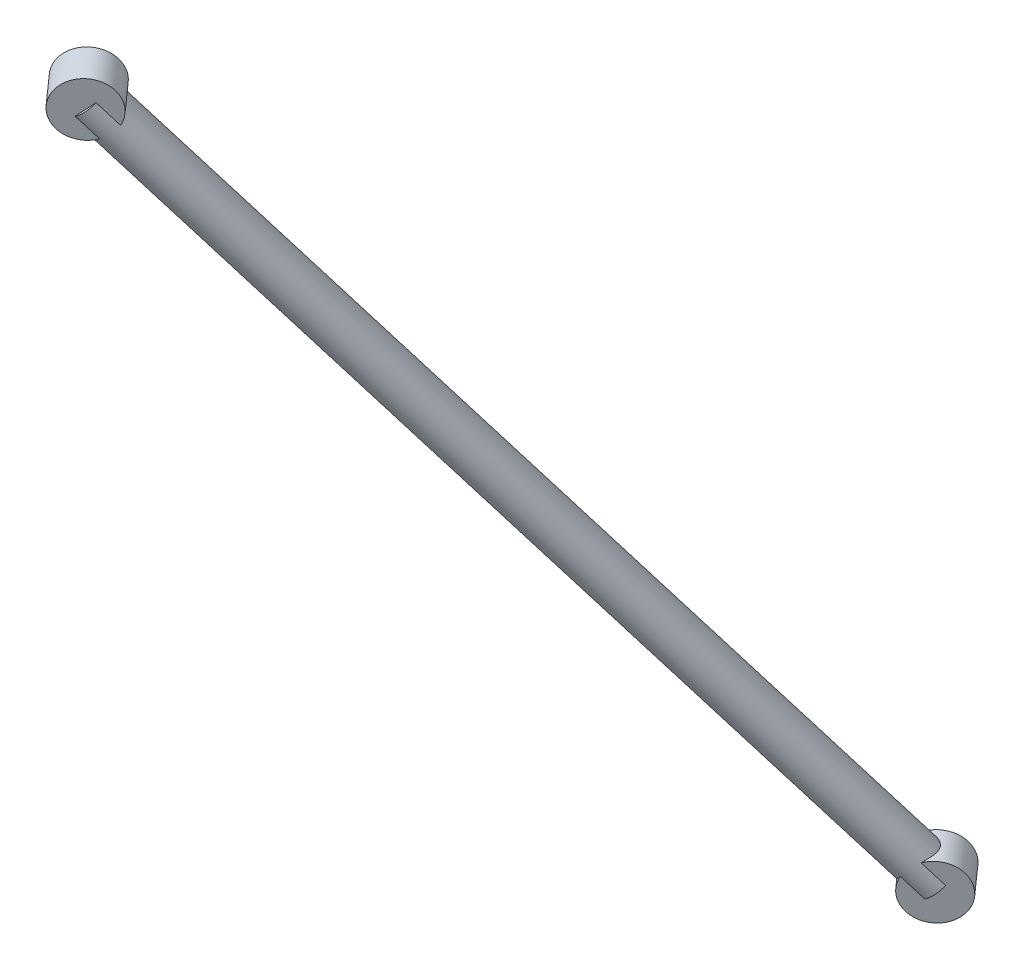
ISO-10303-21;
HEADER;
FILE_DESCRIPTION(('STEP AP214'),'2;1');
FILE_NAME('part.step','',(''),(''),'','','');
FILE_SCHEMA(('AUTOMOTIVE_DESIGN { 1 0 10303 214 1 1 1 1 }'));
ENDSEC;
DATA;
#1=APPLICATION_CONTEXT('core data for automotive mechanical design processes');
#2=APPLICATION_PROTOCOL_DEFINITION('international standard','automotive_design',2000,#1);
#3=PRODUCT_CONTEXT('',#1,'mechanical');
#4=PRODUCT('Part','Part','',(#3));
#5=PRODUCT_RELATED_PRODUCT_CATEGORY('part','',(#4));
#6=PRODUCT_DEFINITION_FORMATION('','',#4);
#7=PRODUCT_DEFINITION_CONTEXT('part definition',#1,'design');
#8=PRODUCT_DEFINITION('design','',#6,#7);
#9=PRODUCT_DEFINITION_SHAPE('','',#8);
#10=(LENGTH_UNIT() NAMED_UNIT(*) SI_UNIT(.MILLI.,.METRE.));
#11=(NAMED_UNIT(*) PLANE_ANGLE_UNIT() SI_UNIT($,.RADIAN.));
#12=(NAMED_UNIT(*) SI_UNIT($,.STERADIAN.) SOLID_ANGLE_UNIT());
#13=UNCERTAINTY_MEASURE_WITH_UNIT(LENGTH_MEASURE(1.E-05),#10,'distance_accuracy_value','');
#14=(GEOMETRIC_REPRESENTATION_CONTEXT(3) GLOBAL_UNCERTAINTY_ASSIGNED_CONTEXT((#13)) GLOBAL_UNIT_ASSIGNED_CONTEXT((#10,
#11,#12)) REPRESENTATION_CONTEXT('',''));
#15=CARTESIAN_POINT('',(0.,0.,0.));
#16=DIRECTION('',(0.,0.,1.));
#17=DIRECTION('',(1.,0.,0.));
#18=AXIS2_PLACEMENT_3D('',#15,#16,#17);
#19=CARTESIAN_POINT('',(-503.54,1408.46,-83.29));
#20=DIRECTION('',(0.463004376310124,-0.750306246149666,-0.47187655642813));
#21=DIRECTION('',(0.,0.532378141285444,-0.846506653654569));
#22=AXIS2_PLACEMENT_3D('',#19,#20,#21);
#23=CYLINDRICAL_SURFACE('',#22,8.);
#24=CARTESIAN_POINT('',(-491.863914324977,1402.83234435317,-84.7036876880866));
#25=CARTESIAN_POINT('',(-491.85256620821,1403.03874333603,-84.8521431734616));
#26=CARTESIAN_POINT('',(-491.853287924258,1403.24490120247,-85.0016301794647));
#27=CARTESIAN_POINT('',(-491.877322921821,1403.65437679307,-85.3023329251552));
#28=CARTESIAN_POINT('',(-491.900617023416,1403.85769677982,-85.4535470894709));
#29=CARTESIAN_POINT('',(-491.968344198661,1404.26014747147,-85.7581152110207));
#30=CARTESIAN_POINT('',(-492.012845517434,1404.45926246889,-85.9114745137641));
#31=CARTESIAN_POINT('',(-492.121533488613,1404.85059188627,-86.2200816451214));
#32=CARTESIAN_POINT('',(-492.18572451396,1405.04280476272,-86.3753298858918));
#33=CARTESIAN_POINT('',(-492.332203904931,1405.41761759253,-86.6877107418468));
#34=CARTESIAN_POINT('',(-492.414441410112,1405.60024280921,-86.8448369106474));
#35=CARTESIAN_POINT('',(-492.595857595428,1405.95412613622,-87.1621270032458));
#36=CARTESIAN_POINT('',(-492.695037630244,1406.12538333606,-87.3222911690431));
#37=CARTESIAN_POINT('',(-492.908994015216,1406.45354399163,-87.646353856462));
#38=CARTESIAN_POINT('',(-493.023746944959,1406.61046842087,-87.8102464684589));
#39=CARTESIAN_POINT('',(-493.267607604801,1406.90684345209,-88.1428657297398));
#40=CARTESIAN_POINT('',(-493.396708608668,1407.04630217714,-88.3115900866422));
#41=CARTESIAN_POINT('',(-493.7169283371,1407.35035002569,-88.716970107371));
#42=CARTESIAN_POINT('',(-493.913647892242,1407.50592670619,-88.9562246516567));
#43=CARTESIAN_POINT('',(-494.222550638404,1407.70069568203,-89.3232976855168));
#44=CARTESIAN_POINT('',(-494.327765298759,1407.75916612557,-89.446955818845));
#45=CARTESIAN_POINT('',(-494.541997226632,1407.86193790932,-89.6968007749519));
#46=CARTESIAN_POINT('',(-494.651012529246,1407.9062464541,-89.822986277152));
#47=CARTESIAN_POINT('',(-494.87281999964,1407.97984936826,-90.078420282753));
#48=CARTESIAN_POINT('',(-494.985636488568,1408.00901214188,-90.2076857495064));
#49=CARTESIAN_POINT('',(-495.213055890507,1408.05099235054,-90.4673048051152));
#50=CARTESIAN_POINT('',(-495.327658767294,1408.06381011658,-90.5976583718826));
#51=CARTESIAN_POINT('',(-495.557638236335,1408.07293859936,-90.8583315418811));
#52=CARTESIAN_POINT('',(-495.673015082423,1408.06924360672,-90.9886511177824));
#53=CARTESIAN_POINT('',(-495.903625617038,1408.04579310789,-91.2479445685601));
#54=CARTESIAN_POINT('',(-496.018859304315,1408.02603746241,-91.3769184317567));
#55=CARTESIAN_POINT('',(-496.237149823912,1407.97415441211,-91.6196025105796));
#56=CARTESIAN_POINT('',(-496.340279348235,1407.94345064141,-91.7335564588313));
#57=CARTESIAN_POINT('',(-496.545693496825,1407.87074669722,-91.9586126412972));
#58=CARTESIAN_POINT('',(-496.6479778034,1407.82874245899,-92.0697138336037));
#59=CARTESIAN_POINT('',(-496.953514905836,1407.68726425408,-92.3978087351166));
#60=CARTESIAN_POINT('',(-497.155409552831,1407.57233564368,-92.609546244689));
#61=CARTESIAN_POINT('',(-497.513337747955,1407.337530276,-92.9714818295932));
#62=CARTESIAN_POINT('',(-497.670019616982,1407.22386825422,-93.1252097360849));
#63=CARTESIAN_POINT('',(-497.982266716549,1406.9794767482,-93.4198936774244));
#64=CARTESIAN_POINT('',(-498.137831408804,1406.84873955176,-93.5608438920456));
#65=CARTESIAN_POINT('',(-498.448785468465,1406.57290408482,-93.8287850867103));
#66=CARTESIAN_POINT('',(-498.604174203398,1406.42778414654,-93.95575437776));
#67=CARTESIAN_POINT('',(-498.915282476585,1406.12574104747,-94.1942578580876));
#68=CARTESIAN_POINT('',(-499.071001982437,1405.96881899527,-94.3057934942779));
#69=CARTESIAN_POINT('',(-499.380411294963,1405.64826798491,-94.510192865804));
#70=CARTESIAN_POINT('',(-499.534083742902,1405.4848221541,-94.6033700159154));
#71=CARTESIAN_POINT('',(-499.842647911595,1405.15030656753,-94.7722912405186));
#72=CARTESIAN_POINT('',(-499.997539367585,1404.97923843161,-94.8480389981271));
#73=CARTESIAN_POINT('',(-500.308336606931,1404.63156012017,-94.9805240529461));
#74=CARTESIAN_POINT('',(-500.464238885673,1404.45496487152,-95.0373084104445));
#75=CARTESIAN_POINT('',(-500.777381224974,1404.09743062589,-95.1306475169436));
#76=CARTESIAN_POINT('',(-500.934622233853,1403.91648834934,-95.1671864578548));
#77=CARTESIAN_POINT('',(-501.092381544247,1403.73431411944,-95.1928170826297));
#78=B_SPLINE_CURVE_WITH_KNOTS('',3,(#24,#25,#26,#27,#28,#29,#30,#31,#32,#33,#34,#35,#36,#37,#38,
#39,#40,#41,#42,#43,#44,#45,#46,#47,#48,#49,#50,#51,#52,#53,#54,#55,#56,#57,#58,#59,#60,#61,#62,
#63,#64,#65,#66,#67,#68,#69,#70,#71,#72,#73,#74,#75,#76,#77),.UNSPECIFIED.,.F.,.F.,(4,2,2,2,2,2,
2,2,2,2,2,2,2,2,2,2,2,2,2,2,2,2,2,2,2,2,4),(0.,0.763011542653619,1.52537531682717,
2.29020912733124,3.05521292503443,3.81808778439847,4.58102366988254,5.34282461898683,
6.10426993796315,7.13968921486128,7.6568748493582,8.17379695619256,8.69513827194054,
9.21646903022712,9.73798005564118,10.2594956035652,10.7292144777066,11.1991025342618,
12.1390705688165,12.8797587803778,13.6207826970853,14.3629404532268,15.1050285845173,
15.8330728947378,16.560963215669,17.2870335154302,18.0136699515921),.UNSPECIFIED.);
#79=CARTESIAN_POINT('',(-491.863914324977,1402.83234435317,-84.7036876880866));
#80=VERTEX_POINT('',#79);
#81=CARTESIAN_POINT('',(-501.092381544247,1403.73431411944,-95.1928170826297));
#82=VERTEX_POINT('',#81);
#83=EDGE_CURVE('E235',#80,#82,#78,.T.);
#84=ORIENTED_EDGE('',*,*,#83,.F.);
#85=CARTESIAN_POINT('',(-491.248775776376,1401.83558166783,-85.330662047099));
#86=CARTESIAN_POINT('',(-492.474135273463,1403.82113862483,-84.0817255479092));
#87=CARTESIAN_POINT('',(-493.699494777207,1405.80669557443,-82.8327890434994));
#88=CARTESIAN_POINT('',(-496.15021379801,1409.77780945886,-80.3349160242396));
#89=CARTESIAN_POINT('',(-497.375573315069,1411.76336639368,-79.0859795093896));
#90=CARTESIAN_POINT('',(-498.600932838785,1413.74892332111,-77.8370429893195));
#91=B_SPLINE_CURVE_WITH_KNOTS('',3,(#85,#86,#87,#88,#89,#90),.UNSPECIFIED.,.F.,.F.,(4,2,4),(0.,
7.93939936961925,15.8787987392386),.UNSPECIFIED.);
#92=CARTESIAN_POINT('',(-496.63096819737,1410.55681775206,-79.8449114866413));
#93=VERTEX_POINT('',#92);
#94=EDGE_CURVE('E145',#80,#93,#91,.T.);
#95=ORIENTED_EDGE('',*,*,#94,.T.);
#96=CARTESIAN_POINT('',(-503.54,1408.46,-83.29));
#97=DIRECTION('',(0.463004376310124,-0.750306246149666,-0.471876556428131));
#98=DIRECTION('',(0.,0.532378141285444,-0.846506653654569));
#99=AXIS2_PLACEMENT_3D('',#96,#97,#98);
#100=CIRCLE('',#99,8.);
#101=CARTESIAN_POINT('',(-501.22125176223,1405.46044954045,-76.2454202644558));
#102=VERTEX_POINT('',#101);
#103=EDGE_CURVE('E133',#93,#102,#100,.T.);
#104=ORIENTED_EDGE('',*,*,#103,.T.);
#105=CARTESIAN_POINT('',(-501.230020040587,1405.47466099881,-76.2364829795065));
#106=CARTESIAN_POINT('',(-500.361767520144,1404.06741387008,-77.1214708719437));
#107=CARTESIAN_POINT('',(-499.493514996358,1402.66016674506,-78.0064587670026));
#108=CARTESIAN_POINT('',(-497.757009942099,1399.84567250244,-79.7764345623638));
#109=CARTESIAN_POINT('',(-496.888757411626,1398.43842538484,-80.6614224626661));
#110=CARTESIAN_POINT('',(-496.02050487781,1397.03117827095,-81.5464103655901));
#111=B_SPLINE_CURVE_WITH_KNOTS('',3,(#105,#106,#107,#108,#109,#110),.UNSPECIFIED.,.F.,.F.,(4,2,
4),(0.,5.6264282109585,11.2528564219171),.UNSPECIFIED.);
#112=CARTESIAN_POINT('',(-496.454885001526,1397.73521327492,-81.1036576642226));
#113=VERTEX_POINT('',#112);
#114=EDGE_CURVE('E241',#102,#113,#111,.T.);
#115=ORIENTED_EDGE('',*,*,#114,.T.);
#116=CARTESIAN_POINT('',(-505.681977863056,1398.63870892363,-91.5938647674842));
#117=CARTESIAN_POINT('',(-505.767014122679,1398.55166417616,-91.370366511703));
#118=CARTESIAN_POINT('',(-505.844538407707,1398.47224404748,-91.1411909301005));
#119=CARTESIAN_POINT('',(-505.983955243631,1398.32751807952,-90.6740168414139));
#120=CARTESIAN_POINT('',(-506.045861016426,1398.26220030866,-90.4360259940088));
#121=CARTESIAN_POINT('',(-506.153753193611,1398.14421019957,-89.9525865620582));
#122=CARTESIAN_POINT('',(-506.199687571368,1398.09157935648,-89.7071163860279));
#123=CARTESIAN_POINT('',(-506.274694789413,1397.99778939165,-89.2114098213395));
#124=CARTESIAN_POINT('',(-506.303763878213,1397.95663282327,-88.9611723850348));
#125=CARTESIAN_POINT('',(-506.344065487697,1397.88435035368,-88.4585486721727));
#126=CARTESIAN_POINT('',(-506.355347469127,1397.85319682997,-88.2061703233124));
#127=CARTESIAN_POINT('',(-506.359013735236,1397.79908002656,-87.700371526914));
#128=CARTESIAN_POINT('',(-506.351396511301,1397.77611740086,-87.4469509977969));
#129=CARTESIAN_POINT('',(-506.315654241644,1397.73657934558,-86.941381808078));
#130=CARTESIAN_POINT('',(-506.287559612271,1397.71999449846,-86.6892318189824));
#131=CARTESIAN_POINT('',(-506.208924569808,1397.69117874265,-86.1883455193517));
#132=CARTESIAN_POINT('',(-506.158394628203,1397.67894580755,-85.9396076719991));
#133=CARTESIAN_POINT('',(-506.009693451078,1397.65262687773,-85.3594795990231));
#134=CARTESIAN_POINT('',(-505.900918818933,1397.63945991859,-85.0305813243753));
#135=CARTESIAN_POINT('',(-505.699457879853,1397.6186588124,-84.5539732755285));
#136=CARTESIAN_POINT('',(-505.625968013687,1397.61155386684,-84.3979686741826));
#137=CARTESIAN_POINT('',(-505.465863279637,1397.59641235731,-84.0929265419795));
#138=CARTESIAN_POINT('',(-505.379255120524,1397.58837627002,-83.9438855006047));
#139=CARTESIAN_POINT('',(-505.192106116736,1397.57086902911,-83.6530827105097));
#140=CARTESIAN_POINT('',(-505.09145237154,1397.56138618196,-83.5113941797457));
#141=CARTESIAN_POINT('',(-504.877286800297,1397.54083267163,-83.2382072114555));
#142=CARTESIAN_POINT('',(-504.763775235656,1397.52976204073,-83.1067085668554));
#143=CARTESIAN_POINT('',(-504.524850196801,1397.5061029537,-82.855082361768));
#144=CARTESIAN_POINT('',(-504.399432640917,1397.49351397663,-82.7349587293134));
#145=CARTESIAN_POINT('',(-504.138102699315,1397.46716585418,-82.5068956554399));
#146=CARTESIAN_POINT('',(-504.002190223709,1397.45340669879,-82.3989563183969));
#147=CARTESIAN_POINT('',(-503.735410545092,1397.42667994505,-82.2056471585028));
#148=CARTESIAN_POINT('',(-503.605386107548,1397.41376973532,-82.1191003350518));
#149=CARTESIAN_POINT('',(-503.339215332545,1397.38795804921,-81.9559568406847));
#150=CARTESIAN_POINT('',(-503.203066807079,1397.37505657765,-81.8793637646591));
#151=CARTESIAN_POINT('',(-502.786900751246,1397.33717699197,-81.6640004818221));
#152=CARTESIAN_POINT('',(-502.499215260618,1397.31302931977,-81.5396834340206));
#153=CARTESIAN_POINT('',(-501.973499746772,1397.27582385085,-81.3487416460397));
#154=CARTESIAN_POINT('',(-501.737876471371,1397.26150024685,-81.2754731689921));
#155=CARTESIAN_POINT('',(-501.260987845144,1397.23896807349,-81.1485930169591));
#156=CARTESIAN_POINT('',(-501.019719985461,1397.23076227869,-81.0949902664389));
#157=CARTESIAN_POINT('',(-500.533403300467,1397.2223010552,-81.0057721834515));
#158=CARTESIAN_POINT('',(-500.288349250034,1397.22205782294,-80.9701845272163));
#159=CARTESIAN_POINT('',(-499.796593202122,1397.2312403937,-80.9157827080454));
#160=CARTESIAN_POINT('',(-499.549891361309,1397.24066529015,-80.8969669727524));
#161=CARTESIAN_POINT('',(-499.06111619334,1397.2704798162,-80.8753260456659));
#162=CARTESIAN_POINT('',(-498.819043126653,1397.2906597776,-80.8722066117474));
#163=CARTESIAN_POINT('',(-498.336517766788,1397.34324978083,-80.8805044253597));
#164=CARTESIAN_POINT('',(-498.096065141886,1397.37565723704,-80.8919186008418));
#165=CARTESIAN_POINT('',(-497.619034535195,1397.45393920454,-80.9287735635531));
#166=CARTESIAN_POINT('',(-497.382448354605,1397.49977976898,-80.9541791337005));
#167=CARTESIAN_POINT('',(-496.914329600986,1397.6061673227,-81.0187030094721));
#168=CARTESIAN_POINT('',(-496.68280110955,1397.66672574388,-81.0578319850869));
#169=CARTESIAN_POINT('',(-496.454885001525,1397.73521327492,-81.1036576642227));
#170=B_SPLINE_CURVE_WITH_KNOTS('',3,(#116,#117,#118,#119,#120,#121,#122,#123,#124,#125,#126,
#127,#128,#129,#130,#131,#132,#133,#134,#135,#136,#137,#138,#139,#140,#141,#142,#143,#144,#145,
#146,#147,#148,#149,#150,#151,#152,#153,#154,#155,#156,#157,#158,#159,#160,#161,#162,#163,#164,
#165,#166,#167,#168,#169),.UNSPECIFIED.,.F.,.F.,(4,2,2,2,2,2,2,2,2,2,2,2,2,2,2,2,2,2,2,2,2,2,2,
2,2,2,4),(0.,0.762958906264851,1.52526974359427,2.29004103323215,3.05498237225947,
3.81779285757181,4.58066423562403,5.34240477719363,6.10379015616976,7.13935621584745,
7.65661504598379,8.17361023455515,8.69503018868879,9.21643954399872,9.73802830137107,
10.2596215265592,10.7293351342425,11.1992179147803,12.1391755457856,12.879810570836,
13.6207812874993,14.3628869141437,15.1049229615158,15.8329956148144,16.5609143969497,
17.2870092879687,18.0136699761481),.UNSPECIFIED.);
#171=CARTESIAN_POINT('',(-505.681977863056,1398.63870892363,-91.5938647674842));
#172=VERTEX_POINT('',#171);
#173=EDGE_CURVE('E213',#172,#113,#170,.T.);
#174=ORIENTED_EDGE('',*,*,#173,.F.);
#175=CARTESIAN_POINT('',(-510.631047949373,1406.65811889125,-86.5495702153982));
#176=CARTESIAN_POINT('',(-509.733743856513,1405.20413877994,-87.4641392305622));
#177=CARTESIAN_POINT('',(-508.836439760081,1403.75015867259,-88.3787082485265));
#178=CARTESIAN_POINT('',(-507.041831560075,1400.84219846582,-90.2078462900557));
#179=CARTESIAN_POINT('',(-506.144527456501,1399.38821836641,-91.1224153136206));
#180=CARTESIAN_POINT('',(-505.247223349356,1397.93423827095,-92.0369843399858));
#181=B_SPLINE_CURVE_WITH_KNOTS('',3,(#175,#176,#177,#178,#179,#180),.UNSPECIFIED.,.F.,.F.,(4,2,
4),(0.,5.81384928803006,11.6276985760603),.UNSPECIFIED.);
#182=CARTESIAN_POINT('',(-510.449031802631,1406.36318224794,-86.7350885133583));
#183=VERTEX_POINT('',#182);
#184=EDGE_CURVE('E220',#183,#172,#181,.T.);
#185=ORIENTED_EDGE('',*,*,#184,.F.);
#186=CARTESIAN_POINT('',(-505.85874823777,1411.45955045955,-90.3345797355442));
#187=VERTEX_POINT('',#186);
#188=EDGE_CURVE('E209',#183,#187,#100,.T.);
#189=ORIENTED_EDGE('',*,*,#188,.T.);
#190=CARTESIAN_POINT('',(-500.476936742048,1402.73681289455,-95.820124447099));
#191=CARTESIAN_POINT('',(-501.609324016441,1404.57216464494,-94.6659106585216));
#192=CARTESIAN_POINT('',(-502.741711296524,1406.40751638902,-93.5116968654828));
#193=CARTESIAN_POINT('',(-505.006485868069,1410.07821986454,-91.2032692704825));
#194=CARTESIAN_POINT('',(-506.138873159531,1411.91357159598,-90.0490554685209));
#195=CARTESIAN_POINT('',(-507.271260456682,1413.74892332111,-88.894841662098));
#196=B_SPLINE_CURVE_WITH_KNOTS('',3,(#190,#191,#192,#193,#194,#195),.UNSPECIFIED.,.F.,.F.,(4,2,
4),(0.,7.33806773678091,14.6761354735618),.UNSPECIFIED.);
#197=EDGE_CURVE('E148',#82,#187,#196,.T.);
#198=ORIENTED_EDGE('',*,*,#197,.F.);
#199=EDGE_LOOP('',(#84,#95,#104,#115,#174,#185,#189,#198));
#200=FACE_BOUND('',#199,.T.);
#201=CARTESIAN_POINT('',(-341.00651833871,1145.83108584954,-239.529682969112));
#202=CARTESIAN_POINT('',(-341.172177720517,1145.6397954396,-239.556597122161));
#203=CARTESIAN_POINT('',(-341.337254193823,1145.44986776545,-239.595536239592));
#204=CARTESIAN_POINT('',(-341.665912886876,1145.07491227798,-239.695666819362));
#205=CARTESIAN_POINT('',(-341.82949625676,1144.88988043968,-239.756839352127));
#206=CARTESIAN_POINT('',(-342.155647872991,1144.52597287229,-239.899921412107));
#207=CARTESIAN_POINT('',(-342.318211138762,1144.34711894039,-239.981897233272));
#208=CARTESIAN_POINT('',(-342.642035854618,1143.99810524185,-240.164857962472));
#209=CARTESIAN_POINT('',(-342.803297007203,1143.82794741723,-240.265847093186));
#210=CARTESIAN_POINT('',(-343.124489897373,1143.49888015862,-240.48500328592));
#211=CARTESIAN_POINT('',(-343.284424086879,1143.33994071103,-240.6031217127));
#212=CARTESIAN_POINT('',(-343.604104491996,1143.03506146265,-240.855366778555));
#213=CARTESIAN_POINT('',(-343.763850691582,1142.8891227006,-240.989494694761));
#214=CARTESIAN_POINT('',(-344.083765931268,1142.61315735709,-241.272228386061));
#215=CARTESIAN_POINT('',(-344.243933993558,1142.48310750901,-241.420812405285));
#216=CARTESIAN_POINT('',(-344.565675684034,1142.24201380376,-241.731065545546));
#217=CARTESIAN_POINT('',(-344.727248622055,1142.1309611133,-241.892728533335));
#218=CARTESIAN_POINT('',(-345.11154091493,1141.89571471344,-242.288116783261));
#219=CARTESIAN_POINT('',(-345.335327186086,1141.78118985803,-242.526828167739));
#220=CARTESIAN_POINT('',(-345.674006028582,1141.64964461884,-242.895836183943));
#221=CARTESIAN_POINT('',(-345.787340666506,1141.6125118581,-243.020596329088));
#222=CARTESIAN_POINT('',(-346.014805824079,1141.55286637628,-243.272817482964));
#223=CARTESIAN_POINT('',(-346.128935908633,1141.53034621316,-243.40027708268));
#224=CARTESIAN_POINT('',(-346.358452987679,1141.50081424922,-243.657856754941));
#225=CARTESIAN_POINT('',(-346.47384237956,1141.49393682817,-243.787990261048));
#226=CARTESIAN_POINT('',(-346.704074196252,1141.4966527735,-244.048578807764));
#227=CARTESIAN_POINT('',(-346.818916632133,1141.50624580508,-244.179033841784));
#228=CARTESIAN_POINT('',(-347.047064922638,1141.54186979488,-244.439110677927));
#229=CARTESIAN_POINT('',(-347.160370234972,1141.56790640778,-244.568732177914));
#230=CARTESIAN_POINT('',(-347.384306546654,1141.6357708593,-244.826117628685));
#231=CARTESIAN_POINT('',(-347.494937523085,1141.67759883317,-244.953881563549));
#232=CARTESIAN_POINT('',(-347.701650237203,1141.77101501531,-245.194292498207));
#233=CARTESIAN_POINT('',(-347.798084620395,1141.8212186285,-245.307179111735));
#234=CARTESIAN_POINT('',(-347.98728861211,1141.93248278944,-245.530676450615));
#235=CARTESIAN_POINT('',(-348.080056888213,1141.99354724094,-245.641286341636));
#236=CARTESIAN_POINT('',(-348.352076800689,1142.19146527439,-245.969682462438));
#237=CARTESIAN_POINT('',(-348.525003016604,1142.34302458319,-246.183988504919));
#238=CARTESIAN_POINT('',(-348.815653639312,1142.64121115974,-246.559257473608));
#239=CARTESIAN_POINT('',(-348.937307838974,1142.78206908241,-246.721895309948));
#240=CARTESIAN_POINT('',(-349.166701003242,1143.07938342211,-247.042850132445));
#241=CARTESIAN_POINT('',(-349.2744336358,1143.23584688021,-247.201165126773));
#242=CARTESIAN_POINT('',(-349.474917964812,1143.56165385561,-247.51451992591));
#243=CARTESIAN_POINT('',(-349.56764646294,1143.73101673364,-247.669554342865));
#244=CARTESIAN_POINT('',(-349.736816015642,1144.07998624468,-247.976913799691));
#245=CARTESIAN_POINT('',(-349.813258596503,1144.25959191576,-248.12923909223));
#246=CARTESIAN_POINT('',(-349.947408991951,1144.62349995235,-248.428960569284));
#247=CARTESIAN_POINT('',(-350.005442286109,1144.80765033519,-248.576395568843));
#248=CARTESIAN_POINT('',(-350.103483380563,1145.18193438908,-248.869592728141));
#249=CARTESIAN_POINT('',(-350.14349498778,1145.37206678738,-249.015355234834));
#250=CARTESIAN_POINT('',(-350.20413820045,1145.75607938192,-249.305012240096));
#251=CARTESIAN_POINT('',(-350.224818113736,1145.94994899389,-249.448910504074));
#252=CARTESIAN_POINT('',(-350.245653446693,1146.34015837513,-249.735125869386));
#253=CARTESIAN_POINT('',(-350.24579286045,1146.53649995151,-249.877441651251));
#254=CARTESIAN_POINT('',(-350.234985767874,1146.73305514412,-250.018811819599));
#255=B_SPLINE_CURVE_WITH_KNOTS('',3,(#201,#202,#203,#204,#205,#206,#207,#208,#209,#210,#211,
#212,#213,#214,#215,#216,#217,#218,#219,#220,#221,#222,#223,#224,#225,#226,#227,#228,#229,#230,
#231,#232,#233,#234,#235,#236,#237,#238,#239,#240,#241,#242,#243,#244,#245,#246,#247,#248,#249,
#250,#251,#252,#253,#254),.UNSPECIFIED.,.F.,.F.,(4,2,2,2,2,2,2,2,2,2,2,2,2,2,2,2,2,2,2,2,2,2,2,
2,2,2,4),(0.,0.762958903337806,1.52526973777848,2.29004102486487,3.05498236133041,
3.81779284427707,4.58066421996893,5.34240475902513,6.10379013547645,7.13935618763486,
7.65661501402473,8.17361019885503,8.69503014893593,9.21643950019527,9.73802825355995,
10.259621474743,10.7293350827113,11.1992178635342,12.1391754951351,12.8798105275256,
13.6207812515719,14.3628868854093,15.1049229398328,15.8329954362103,16.5609140614509,
17.2870087949181,18.0136693251059),.UNSPECIFIED.);
#256=CARTESIAN_POINT('',(-341.00651833871,1145.83108584954,-239.529682969112));
#257=VERTEX_POINT('',#256);
#258=CARTESIAN_POINT('',(-350.234985767874,1146.73305514412,-250.018811819599));
#259=VERTEX_POINT('',#258);
#260=EDGE_CURVE('E12',#257,#259,#255,.T.);
#261=ORIENTED_EDGE('',*,*,#260,.F.);
#262=CARTESIAN_POINT('',(-341.621963119042,1146.82858710942,-238.902375596946));
#263=CARTESIAN_POINT('',(-340.489575924192,1144.99323535836,-240.056589359618));
#264=CARTESIAN_POINT('',(-339.357188723648,1143.15788361361,-241.210803126755));
#265=CARTESIAN_POINT('',(-337.092414311171,1139.48718013677,-243.519230669959));
#266=CARTESIAN_POINT('',(-335.960027099239,1137.65182840467,-244.673444446027));
#267=CARTESIAN_POINT('',(-334.827639881612,1135.81647667889,-245.82765822656));
#268=B_SPLINE_CURVE_WITH_KNOTS('',3,(#262,#263,#264,#265,#266,#267),.UNSPECIFIED.,.F.,.F.,(4,2,
4),(0.,7.33806759114756,14.6761351822952),.UNSPECIFIED.);
#269=CARTESIAN_POINT('',(-336.240151932525,1138.10584942975,-244.387920255536));
#270=VERTEX_POINT('',#269);
#271=EDGE_CURVE('E192',#257,#270,#268,.T.);
#272=ORIENTED_EDGE('',*,*,#271,.T.);
#273=CARTESIAN_POINT('',(-338.5589,1141.1054,-251.4325));
#274=DIRECTION('',(0.463004376310124,-0.750306246149666,-0.471876556428131));
#275=DIRECTION('',(0.,0.532378141285444,-0.846506653654569));
#276=AXIS2_PLACEMENT_3D('',#273,#274,#275);
#277=CIRCLE('',#276,8.);
#278=CARTESIAN_POINT('',(-331.64986811446,1143.20221800438,-247.987411806485));
#279=VERTEX_POINT('',#278);
#280=EDGE_CURVE('E132',#279,#270,#277,.T.);
#281=ORIENTED_EDGE('',*,*,#280,.F.);
#282=CARTESIAN_POINT('',(-331.467852050627,1142.90728150559,-248.172930026138));
#283=CARTESIAN_POINT('',(-332.36515613354,1144.36126155061,-247.258360990557));
#284=CARTESIAN_POINT('',(-333.262460220026,1145.81524159165,-246.343791952174));
#285=CARTESIAN_POINT('',(-335.057068400148,1148.72320166581,-244.514653869803));
#286=CARTESIAN_POINT('',(-335.954372493784,1150.17718169892,-243.600084825815));
#287=CARTESIAN_POINT('',(-336.851676590993,1151.63116172806,-242.685515779023));
#288=B_SPLINE_CURVE_WITH_KNOTS('',3,(#282,#283,#284,#285,#286,#287),.UNSPECIFIED.,.F.,.F.,(4,2,
4),(0.,5.81384915389519,11.6276983077905),.UNSPECIFIED.);
#289=CARTESIAN_POINT('',(-336.416922064033,1150.92669107823,-243.128635379842));
#290=VERTEX_POINT('',#289);
#291=EDGE_CURVE('E186',#279,#290,#288,.T.);
#292=ORIENTED_EDGE('',*,*,#291,.T.);
#293=CARTESIAN_POINT('',(-345.644014540901,1151.83018691538,-253.618842405312));
#294=CARTESIAN_POINT('',(-345.404681100667,1151.90210742634,-253.666959957919));
#295=CARTESIAN_POINT('',(-345.161375060422,1151.96527909151,-253.707696509068));
#296=CARTESIAN_POINT('',(-344.669301363235,1152.07544401846,-253.774008352541));
#297=CARTESIAN_POINT('',(-344.420538518361,1152.12245096959,-253.799596486848));
#298=CARTESIAN_POINT('',(-343.918809220519,1152.2018516448,-253.835353020702));
#299=CARTESIAN_POINT('',(-343.665831759334,1152.23419752892,-253.845471192059));
#300=CARTESIAN_POINT('',(-343.158358530648,1152.28561991142,-253.84957325341));
#301=CARTESIAN_POINT('',(-342.903862438194,1152.30469345903,-253.843553556999));
#302=CARTESIAN_POINT('',(-342.395941955223,1152.33117102577,-253.814598299296));
#303=CARTESIAN_POINT('',(-342.142516553224,1152.33860737245,-253.791709859964));
#304=CARTESIAN_POINT('',(-341.637814243961,1152.3436528448,-253.727925976049));
#305=CARTESIAN_POINT('',(-341.386537510188,1152.3412611843,-253.687029091142));
#306=CARTESIAN_POINT('',(-340.888478127186,1152.32852621961,-253.585746988661));
#307=CARTESIAN_POINT('',(-340.641689348647,1152.31819474953,-253.525390852301));
#308=CARTESIAN_POINT('',(-340.154802765657,1152.29163954342,-253.383341403781));
#309=CARTESIAN_POINT('',(-339.914701891452,1152.27541856032,-253.301658065574));
#310=CARTESIAN_POINT('',(-339.359030943027,1152.23278076073,-253.080908148123));
#311=CARTESIAN_POINT('',(-339.04739030398,1152.20479539892,-252.931769490945));
#312=CARTESIAN_POINT('',(-338.60140044002,1152.16222763404,-252.672193947738));
#313=CARTESIAN_POINT('',(-338.456383738931,1152.14794747906,-252.579746768408));
#314=CARTESIAN_POINT('',(-338.174874784469,1152.11987014537,-252.382657407517));
#315=CARTESIAN_POINT('',(-338.038378225186,1152.10607272428,-252.278021463821));
#316=CARTESIAN_POINT('',(-337.774281921993,1152.07942108905,-252.055748455692));
#317=CARTESIAN_POINT('',(-337.64676821372,1152.06657594687,-251.938007891184));
#318=CARTESIAN_POINT('',(-337.403355760228,1152.04235209343,-251.690929885102));
#319=CARTESIAN_POINT('',(-337.287456779853,1152.03097335246,-251.561592678419));
#320=CARTESIAN_POINT('',(-337.06831930368,1152.00980758041,-251.292417742724));
#321=CARTESIAN_POINT('',(-336.965085199527,1152.00002110107,-251.152576398269));
#322=CARTESIAN_POINT('',(-336.771924618683,1151.98189278397,-250.86391643421));
#323=CARTESIAN_POINT('',(-336.681998257403,1151.97355095874,-250.715097736766));
#324=CARTESIAN_POINT('',(-336.523823835761,1151.95869006321,-250.425273372085));
#325=CARTESIAN_POINT('',(-336.454309763859,1151.95207224461,-250.28495971917));
#326=CARTESIAN_POINT('',(-336.3259125465,1151.93926806113,-249.999510372098));
#327=CARTESIAN_POINT('',(-336.267033239086,1151.93308185251,-249.85437295935));
#328=CARTESIAN_POINT('',(-336.105715541838,1151.91444030383,-249.413187778907));
#329=CARTESIAN_POINT('',(-336.018627692925,1151.90190453484,-249.111424015345));
#330=CARTESIAN_POINT('',(-335.895853984429,1151.87562935329,-248.565090998093));
#331=CARTESIAN_POINT('',(-335.853184878156,1151.86270856635,-248.321959473704));
#332=CARTESIAN_POINT('',(-335.788522289529,1151.83221906498,-247.833131032799));
#333=CARTESIAN_POINT('',(-335.766538186841,1151.81464824661,-247.587433003504));
#334=CARTESIAN_POINT('',(-335.741508956038,1151.77303531644,-247.095282582063));
#335=CARTESIAN_POINT('',(-335.738492857869,1151.74898334408,-246.848829610896));
#336=CARTESIAN_POINT('',(-335.750067240162,1151.6927676192,-246.357293094435));
#337=CARTESIAN_POINT('',(-335.764656068902,1151.66060462789,-246.112209422839));
#338=CARTESIAN_POINT('',(-335.809951504602,1151.58734424515,-245.629666813152));
#339=CARTESIAN_POINT('',(-335.840347857506,1151.54642745662,-245.392151355079));
#340=CARTESIAN_POINT('',(-335.916324098876,1151.45400656143,-244.921691172663));
#341=CARTESIAN_POINT('',(-335.961900774499,1151.40250469593,-244.688745492185));
#342=CARTESIAN_POINT('',(-336.067543978389,1151.28782946614,-244.229706912149));
#343=CARTESIAN_POINT('',(-336.127573991209,1151.22468560732,-244.003598334244));
#344=CARTESIAN_POINT('',(-336.261764630562,1151.08556783055,-243.559481167337));
#345=CARTESIAN_POINT('',(-336.335936238611,1151.00958394705,-243.341479031579));
#346=CARTESIAN_POINT('',(-336.416922064033,1150.92669107823,-243.128635379842));
#347=B_SPLINE_CURVE_WITH_KNOTS('',3,(#293,#294,#295,#296,#297,#298,#299,#300,#301,#302,#303,
#304,#305,#306,#307,#308,#309,#310,#311,#312,#313,#314,#315,#316,#317,#318,#319,#320,#321,#322,
#323,#324,#325,#326,#327,#328,#329,#330,#331,#332,#333,#334,#335,#336,#337,#338,#339,#340,#341,
#342,#343,#344,#345,#346),.UNSPECIFIED.,.F.,.F.,(4,2,2,2,2,2,2,2,2,2,2,2,2,2,2,2,2,2,2,2,2,2,2,
2,2,2,4),(0.,0.763011562492763,1.5253753566735,2.29020919167073,3.05521301383039,
3.81808789867569,4.58102380970407,5.34282478242513,6.1042701248047,7.13968933071872,
7.65687492982184,8.17379700131716,8.69513827901075,9.21646899926296,9.73797998705937,
10.2594954973921,10.729214374112,11.1991024332501,12.1390704729315,12.8797587148411,
13.6207826619462,14.362940447831,15.1050286087038,15.8330727496988,16.5609629013798,
17.2870330329063,18.0136693005397),.UNSPECIFIED.);
#348=CARTESIAN_POINT('',(-345.644014540901,1151.83018691538,-253.618842405312));
#349=VERTEX_POINT('',#348);
#350=EDGE_CURVE('E75',#349,#290,#347,.T.);
#351=ORIENTED_EDGE('',*,*,#350,.F.);
#352=CARTESIAN_POINT('',(-340.868879798288,1144.09073912575,-258.486017020494));
#353=CARTESIAN_POINT('',(-341.737132244538,1145.49798623356,-257.60102916138));
#354=CARTESIAN_POINT('',(-342.605384694134,1146.90523333766,-256.716041299642));
#355=CARTESIAN_POINT('',(-344.341889600019,1149.71972753844,-254.946065570919));
#356=CARTESIAN_POINT('',(-345.210142056307,1151.12697463511,-254.061077703933));
#357=CARTESIAN_POINT('',(-346.078394515942,1152.53422172806,-253.176089834324));
#358=B_SPLINE_CURVE_WITH_KNOTS('',3,(#352,#353,#354,#355,#356,#357),.UNSPECIFIED.,.F.,.F.,(4,2,
4),(0.,5.62642801365884,11.2528560273176),.UNSPECIFIED.);
#359=CARTESIAN_POINT('',(-340.877648067475,1144.10495057025,-258.477079744463));
#360=VERTEX_POINT('',#359);
#361=EDGE_CURVE('E136',#360,#349,#358,.T.);
#362=ORIENTED_EDGE('',*,*,#361,.F.);
#363=CARTESIAN_POINT('',(-345.467931885541,1139.00858199562,-254.877588193515));
#364=VERTEX_POINT('',#363);
#365=EDGE_CURVE('E127',#364,#360,#277,.T.);
#366=ORIENTED_EDGE('',*,*,#365,.F.);
#367=CARTESIAN_POINT('',(-350.850124162137,1147.72981754499,-249.391837596946));
#368=CARTESIAN_POINT('',(-349.624764703747,1145.74426071918,-250.640774098424));
#369=CARTESIAN_POINT('',(-348.399405238695,1143.75870390076,-251.889710605127));
#370=CARTESIAN_POINT('',(-345.948686295264,1139.78759027873,-254.387583628982));
#371=CARTESIAN_POINT('',(-344.723326816886,1137.80203347511,-255.636520146134));
#372=CARTESIAN_POINT('',(-343.497967331845,1135.81647667889,-256.885456668511));
#373=B_SPLINE_CURVE_WITH_KNOTS('',3,(#367,#368,#369,#370,#371,#372),.UNSPECIFIED.,.F.,.F.,(4,2,
4),(0.,7.93939902383923,15.8787980476782),.UNSPECIFIED.);
#374=EDGE_CURVE('E82',#259,#364,#373,.T.);
#375=ORIENTED_EDGE('',*,*,#374,.F.);
#376=EDGE_LOOP('',(#261,#272,#281,#292,#351,#362,#366,#375));
#377=FACE_BOUND('',#376,.T.);
#378=ADVANCED_FACE('F61',(#200,#377),#23,.T.);
#379=CARTESIAN_POINT('',(-338.5589,1141.1054,-251.4325));
#380=DIRECTION('',(0.463004376310124,-0.750306246149666,-0.471876556428131));
#381=DIRECTION('',(0.,0.532378141285444,-0.846506653654569));
#382=AXIS2_PLACEMENT_3D('',#379,#380,#381);
#383=PLANE('',#382);
#384=ORIENTED_EDGE('',*,*,#280,.T.);
#385=DIRECTION('',(0.592603005788633,0.657938257334944,-0.464692292883511));
#386=VECTOR('',#385,1.);
#387=CARTESIAN_POINT('',(-333.945010023492,1140.65403371707,-246.187666031011));
#388=LINE('',#387,#386);
#389=EDGE_CURVE('E144',#270,#279,#388,.T.);
#390=ORIENTED_EDGE('',*,*,#389,.T.);
#391=EDGE_LOOP('',(#384,#390));
#392=FACE_BOUND('',#391,.T.);
#393=ADVANCED_FACE('F266',(#392),#383,.T.);
#394=CARTESIAN_POINT('',(-503.54,1408.46,-83.29));
#395=DIRECTION('',(0.463004376310124,-0.750306246149666,-0.471876556428131));
#396=DIRECTION('',(0.,0.532378141285444,-0.846506653654569));
#397=AXIS2_PLACEMENT_3D('',#394,#395,#396);
#398=PLANE('',#397);
#399=DIRECTION('',(0.592603014539833,0.657938256478834,-0.464692282935595));
#400=VECTOR('',#399,1.);
#401=CARTESIAN_POINT('',(-498.9261099798,1408.00863364626,-78.0451658755486));
#402=LINE('',#401,#400);
#403=EDGE_CURVE('E206',#102,#93,#402,.T.);
#404=ORIENTED_EDGE('',*,*,#403,.F.);
#405=ORIENTED_EDGE('',*,*,#103,.F.);
#406=EDGE_LOOP('',(#404,#405));
#407=FACE_BOUND('',#406,.T.);
#408=ADVANCED_FACE('F264',(#407),#398,.F.);
#409=ORIENTED_EDGE('',*,*,#188,.F.);
#410=DIRECTION('',(0.592603014539833,0.657938256478834,-0.464692282935595));
#411=VECTOR('',#410,1.);
#412=CARTESIAN_POINT('',(-508.1538900202,1408.91136635374,-88.5348341244512));
#413=LINE('',#412,#411);
#414=EDGE_CURVE('E204',#183,#187,#413,.T.);
#415=ORIENTED_EDGE('',*,*,#414,.T.);
#416=EDGE_LOOP('',(#409,#415));
#417=FACE_BOUND('',#416,.T.);
#418=ADVANCED_FACE('F63',(#417),#398,.F.);
#419=DIRECTION('',(0.592603005788633,0.657938257334944,-0.464692292883511));
#420=VECTOR('',#419,1.);
#421=CARTESIAN_POINT('',(-343.172789976508,1141.55676628293,-256.677333968989));
#422=LINE('',#421,#420);
#423=EDGE_CURVE('E131',#364,#360,#422,.T.);
#424=ORIENTED_EDGE('',*,*,#423,.F.);
#425=ORIENTED_EDGE('',*,*,#365,.T.);
#426=EDGE_LOOP('',(#424,#425));
#427=FACE_BOUND('',#426,.T.);
#428=ADVANCED_FACE('F129',(#427),#383,.T.);
#429=CARTESIAN_POINT('',(-498.926009,1408.00847,-78.0452688));
#430=DIRECTION('',(-0.659141587239661,0.0645042872616206,-0.749247332258214));
#431=DIRECTION('',(-0.750810948680664,0.,0.660517160519877));
#432=AXIS2_PLACEMENT_3D('',#429,#430,#431);
#433=PLANE('',#432);
#434=ORIENTED_EDGE('',*,*,#114,.F.);
#435=ORIENTED_EDGE('',*,*,#403,.T.);
#436=ORIENTED_EDGE('',*,*,#94,.F.);
#437=CARTESIAN_POINT('',(-498.926009,1408.00847,-78.0452688));
#438=DIRECTION('',(-0.659141587239661,0.0645042872616206,-0.749247332258214));
#439=DIRECTION('',(-0.750810948680664,0.,0.660517160519877));
#440=AXIS2_PLACEMENT_3D('',#437,#438,#439);
#441=CIRCLE('',#440,11.);
#442=EDGE_CURVE('E198',#113,#80,#441,.T.);
#443=ORIENTED_EDGE('',*,*,#442,.F.);
#444=EDGE_LOOP('',(#434,#435,#436,#443));
#445=FACE_BOUND('',#444,.T.);
#446=ADVANCED_FACE('F166',(#445),#433,.F.);
#447=CARTESIAN_POINT('',(-508.153991,1408.91153,-88.5347312));
#448=DIRECTION('',(-0.659141587239661,0.0645042872616206,-0.749247332258214));
#449=DIRECTION('',(-0.750810948680664,0.,0.660517160519877));
#450=AXIS2_PLACEMENT_3D('',#447,#448,#449);
#451=PLANE('',#450);
#452=CARTESIAN_POINT('',(-508.153991,1408.91153,-88.5347312));
#453=DIRECTION('',(-0.659141587239661,0.0645042872616206,-0.749247332258214));
#454=DIRECTION('',(-0.750810948680664,0.,0.660517160519877));
#455=AXIS2_PLACEMENT_3D('',#452,#453,#454);
#456=CIRCLE('',#455,11.);
#457=EDGE_CURVE('E201',#172,#82,#456,.T.);
#458=ORIENTED_EDGE('',*,*,#457,.T.);
#459=ORIENTED_EDGE('',*,*,#197,.T.);
#460=ORIENTED_EDGE('',*,*,#414,.F.);
#461=ORIENTED_EDGE('',*,*,#184,.T.);
#462=EDGE_LOOP('',(#458,#459,#460,#461));
#463=FACE_BOUND('',#462,.T.);
#464=ADVANCED_FACE('F230',(#463),#451,.T.);
#465=CARTESIAN_POINT('',(-498.926009,1408.00847,-78.0452688));
#466=DIRECTION('',(-0.659141587239668,0.0645042872615729,-0.749247332258212));
#467=DIRECTION('',(-0.75081094868066,0.,0.660517160519882));
#468=AXIS2_PLACEMENT_3D('',#465,#466,#467);
#469=CYLINDRICAL_SURFACE('',#468,11.);
#470=ORIENTED_EDGE('',*,*,#442,.T.);
#471=ORIENTED_EDGE('',*,*,#83,.T.);
#472=ORIENTED_EDGE('',*,*,#457,.F.);
#473=ORIENTED_EDGE('',*,*,#173,.T.);
#474=EDGE_LOOP('',(#470,#471,#472,#473));
#475=FACE_BOUND('',#474,.T.);
#476=ADVANCED_FACE('F227',(#475),#469,.T.);
#477=CARTESIAN_POINT('',(-333.944909,1140.65387,-246.187769));
#478=DIRECTION('',(-0.65914160134995,0.0645042886424206,-0.749247319725976));
#479=DIRECTION('',(-0.750810936189425,0.,0.66051717471869));
#480=AXIS2_PLACEMENT_3D('',#477,#478,#479);
#481=PLANE('',#480);
#482=ORIENTED_EDGE('',*,*,#271,.F.);
#483=CARTESIAN_POINT('',(-333.944909,1140.65387,-246.187769));
#484=DIRECTION('',(-0.65914160134995,0.0645042886424206,-0.749247319725976));
#485=DIRECTION('',(-0.750810936189425,0.,0.66051717471869));
#486=AXIS2_PLACEMENT_3D('',#483,#484,#485);
#487=CIRCLE('',#486,11.);
#488=EDGE_CURVE('E391',#290,#257,#487,.T.);
#489=ORIENTED_EDGE('',*,*,#488,.F.);
#490=ORIENTED_EDGE('',*,*,#291,.F.);
#491=ORIENTED_EDGE('',*,*,#389,.F.);
#492=EDGE_LOOP('',(#482,#489,#490,#491));
#493=FACE_BOUND('',#492,.T.);
#494=ADVANCED_FACE('F171',(#493),#481,.F.);
#495=CARTESIAN_POINT('',(-343.172891,1141.55693,-256.677231));
#496=DIRECTION('',(-0.65914160134995,0.0645042886424206,-0.749247319725976));
#497=DIRECTION('',(-0.750810936189425,0.,0.66051717471869));
#498=AXIS2_PLACEMENT_3D('',#495,#496,#497);
#499=PLANE('',#498);
#500=CARTESIAN_POINT('',(-343.172891,1141.55693,-256.677231));
#501=DIRECTION('',(-0.65914160134995,0.0645042886424206,-0.749247319725976));
#502=DIRECTION('',(-0.750810936189425,0.,0.66051717471869));
#503=AXIS2_PLACEMENT_3D('',#500,#501,#502);
#504=CIRCLE('',#503,11.);
#505=EDGE_CURVE('E141',#349,#259,#504,.T.);
#506=ORIENTED_EDGE('',*,*,#505,.T.);
#507=ORIENTED_EDGE('',*,*,#374,.T.);
#508=ORIENTED_EDGE('',*,*,#423,.T.);
#509=ORIENTED_EDGE('',*,*,#361,.T.);
#510=EDGE_LOOP('',(#506,#507,#508,#509));
#511=FACE_BOUND('',#510,.T.);
#512=ADVANCED_FACE('F143',(#511),#499,.T.);
#513=CARTESIAN_POINT('',(-333.944909,1140.65387,-246.187769));
#514=DIRECTION('',(-0.659141601349954,0.0645042886424207,-0.749247319725972));
#515=DIRECTION('',(-0.750810936189421,0.,0.660517174718694));
#516=AXIS2_PLACEMENT_3D('',#513,#514,#515);
#517=CYLINDRICAL_SURFACE('',#516,11.);
#518=ORIENTED_EDGE('',*,*,#488,.T.);
#519=ORIENTED_EDGE('',*,*,#260,.T.);
#520=ORIENTED_EDGE('',*,*,#505,.F.);
#521=ORIENTED_EDGE('',*,*,#350,.T.);
#522=EDGE_LOOP('',(#518,#519,#520,#521));
#523=FACE_BOUND('',#522,.T.);
#524=ADVANCED_FACE('F161',(#523),#517,.T.);
#525=CLOSED_SHELL('',(#378,#393,#408,#418,#428,#446,#464,#476,#494,#512,#524));
#526=MANIFOLD_SOLID_BREP('B2',#525);
#527=ADVANCED_BREP_SHAPE_REPRESENTATION('',(#18,#526),#14);
#528=SHAPE_DEFINITION_REPRESENTATION(#9,#527);
ENDSEC;
END-ISO-10303-21;
